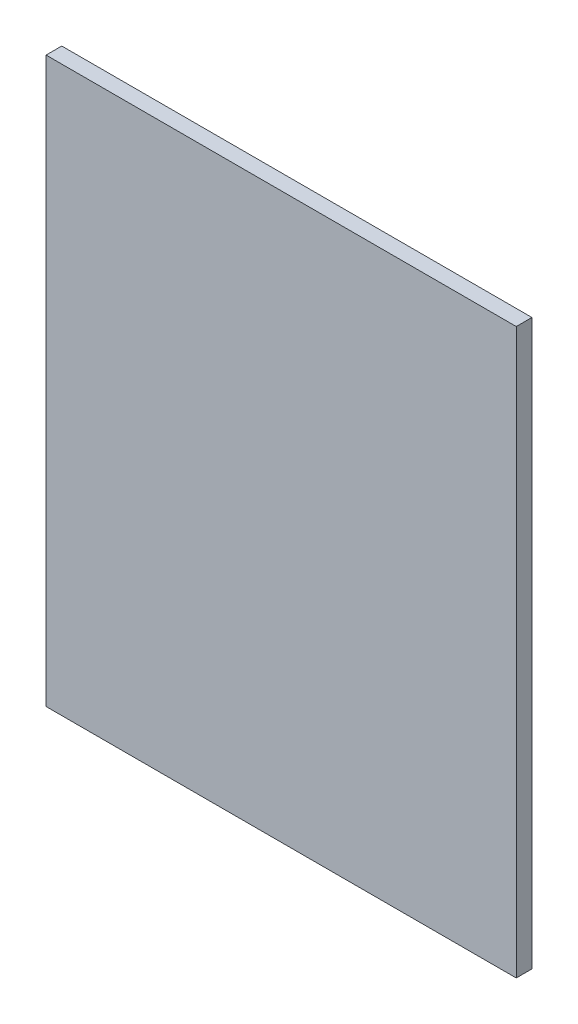
ISO-10303-21;
HEADER;
FILE_DESCRIPTION(('STEP AP214'),'2;1');
FILE_NAME('part.step','',(''),(''),'','','');
FILE_SCHEMA(('AUTOMOTIVE_DESIGN { 1 0 10303 214 1 1 1 1 }'));
ENDSEC;
DATA;
#1=APPLICATION_CONTEXT('core data for automotive mechanical design processes');
#2=APPLICATION_PROTOCOL_DEFINITION('international standard','automotive_design',2000,#1);
#3=PRODUCT_CONTEXT('',#1,'mechanical');
#4=PRODUCT('Part','Part','',(#3));
#5=PRODUCT_RELATED_PRODUCT_CATEGORY('part','',(#4));
#6=PRODUCT_DEFINITION_FORMATION('','',#4);
#7=PRODUCT_DEFINITION_CONTEXT('part definition',#1,'design');
#8=PRODUCT_DEFINITION('design','',#6,#7);
#9=PRODUCT_DEFINITION_SHAPE('','',#8);
#10=(LENGTH_UNIT() NAMED_UNIT(*) SI_UNIT(.MILLI.,.METRE.));
#11=(NAMED_UNIT(*) PLANE_ANGLE_UNIT() SI_UNIT($,.RADIAN.));
#12=(NAMED_UNIT(*) SI_UNIT($,.STERADIAN.) SOLID_ANGLE_UNIT());
#13=UNCERTAINTY_MEASURE_WITH_UNIT(LENGTH_MEASURE(1.E-05),#10,'distance_accuracy_value','');
#14=(GEOMETRIC_REPRESENTATION_CONTEXT(3) GLOBAL_UNCERTAINTY_ASSIGNED_CONTEXT((#13)) GLOBAL_UNIT_ASSIGNED_CONTEXT((#10,
#11,#12)) REPRESENTATION_CONTEXT('',''));
#15=CARTESIAN_POINT('',(0.,0.,0.));
#16=DIRECTION('',(0.,0.,1.));
#17=DIRECTION('',(1.,0.,0.));
#18=AXIS2_PLACEMENT_3D('',#15,#16,#17);
#19=CARTESIAN_POINT('',(0.,0.,6.35));
#20=DIRECTION('',(1.,0.,0.));
#21=DIRECTION('',(0.,1.,0.));
#22=AXIS2_PLACEMENT_3D('',#19,#20,#21);
#23=PLANE('',#22);
#24=DIRECTION('',(0.,-1.,0.));
#25=VECTOR('',#24,1.);
#26=CARTESIAN_POINT('',(0.,0.,0.));
#27=LINE('',#26,#25);
#28=CARTESIAN_POINT('',(0.,228.6,0.));
#29=VERTEX_POINT('',#28);
#30=CARTESIAN_POINT('',(0.,0.,0.));
#31=VERTEX_POINT('',#30);
#32=EDGE_CURVE('E99',#29,#31,#27,.T.);
#33=ORIENTED_EDGE('',*,*,#32,.T.);
#34=DIRECTION('',(0.,0.,-1.));
#35=VECTOR('',#34,1.);
#36=CARTESIAN_POINT('',(0.,0.,6.35));
#37=LINE('',#36,#35);
#38=CARTESIAN_POINT('',(0.,0.,6.35));
#39=VERTEX_POINT('',#38);
#40=EDGE_CURVE('E11',#39,#31,#37,.T.);
#41=ORIENTED_EDGE('',*,*,#40,.F.);
#42=DIRECTION('',(0.,-1.,0.));
#43=VECTOR('',#42,1.);
#44=CARTESIAN_POINT('',(0.,0.,6.35));
#45=LINE('',#44,#43);
#46=CARTESIAN_POINT('',(0.,228.6,6.35));
#47=VERTEX_POINT('',#46);
#48=EDGE_CURVE('E87',#47,#39,#45,.T.);
#49=ORIENTED_EDGE('',*,*,#48,.F.);
#50=DIRECTION('',(0.,0.,-1.));
#51=VECTOR('',#50,1.);
#52=CARTESIAN_POINT('',(0.,228.6,6.35));
#53=LINE('',#52,#51);
#54=EDGE_CURVE('E95',#47,#29,#53,.T.);
#55=ORIENTED_EDGE('',*,*,#54,.T.);
#56=EDGE_LOOP('',(#33,#41,#49,#55));
#57=FACE_BOUND('',#56,.T.);
#58=ADVANCED_FACE('F36',(#57),#23,.F.);
#59=CARTESIAN_POINT('',(0.,0.,6.35));
#60=DIRECTION('',(0.,1.,0.));
#61=DIRECTION('',(0.,0.,1.));
#62=AXIS2_PLACEMENT_3D('',#59,#60,#61);
#63=PLANE('',#62);
#64=DIRECTION('',(1.,0.,0.));
#65=VECTOR('',#64,1.);
#66=CARTESIAN_POINT('',(0.,0.,0.));
#67=LINE('',#66,#65);
#68=CARTESIAN_POINT('',(190.5,0.,0.));
#69=VERTEX_POINT('',#68);
#70=EDGE_CURVE('E91',#31,#69,#67,.T.);
#71=ORIENTED_EDGE('',*,*,#70,.T.);
#72=DIRECTION('',(0.,0.,-1.));
#73=VECTOR('',#72,1.);
#74=CARTESIAN_POINT('',(190.5,0.,6.35));
#75=LINE('',#74,#73);
#76=CARTESIAN_POINT('',(190.5,0.,6.35));
#77=VERTEX_POINT('',#76);
#78=EDGE_CURVE('E44',#77,#69,#75,.T.);
#79=ORIENTED_EDGE('',*,*,#78,.F.);
#80=DIRECTION('',(1.,0.,0.));
#81=VECTOR('',#80,1.);
#82=CARTESIAN_POINT('',(0.,0.,6.35));
#83=LINE('',#82,#81);
#84=EDGE_CURVE('E82',#39,#77,#83,.T.);
#85=ORIENTED_EDGE('',*,*,#84,.F.);
#86=ORIENTED_EDGE('',*,*,#40,.T.);
#87=EDGE_LOOP('',(#71,#79,#85,#86));
#88=FACE_BOUND('',#87,.T.);
#89=ADVANCED_FACE('F90',(#88),#63,.F.);
#90=CARTESIAN_POINT('',(190.5,0.,6.35));
#91=DIRECTION('',(-1.,0.,0.));
#92=DIRECTION('',(0.,-1.,0.));
#93=AXIS2_PLACEMENT_3D('',#90,#91,#92);
#94=PLANE('',#93);
#95=DIRECTION('',(0.,1.,0.));
#96=VECTOR('',#95,1.);
#97=CARTESIAN_POINT('',(190.5,0.,0.));
#98=LINE('',#97,#96);
#99=CARTESIAN_POINT('',(190.5,228.6,0.));
#100=VERTEX_POINT('',#99);
#101=EDGE_CURVE('E69',#69,#100,#98,.T.);
#102=ORIENTED_EDGE('',*,*,#101,.T.);
#103=DIRECTION('',(0.,0.,-1.));
#104=VECTOR('',#103,1.);
#105=CARTESIAN_POINT('',(190.5,228.6,6.35));
#106=LINE('',#105,#104);
#107=CARTESIAN_POINT('',(190.5,228.6,6.35));
#108=VERTEX_POINT('',#107);
#109=EDGE_CURVE('E92',#108,#100,#106,.T.);
#110=ORIENTED_EDGE('',*,*,#109,.F.);
#111=DIRECTION('',(0.,1.,0.));
#112=VECTOR('',#111,1.);
#113=CARTESIAN_POINT('',(190.5,0.,6.35));
#114=LINE('',#113,#112);
#115=EDGE_CURVE('E85',#77,#108,#114,.T.);
#116=ORIENTED_EDGE('',*,*,#115,.F.);
#117=ORIENTED_EDGE('',*,*,#78,.T.);
#118=EDGE_LOOP('',(#102,#110,#116,#117));
#119=FACE_BOUND('',#118,.T.);
#120=ADVANCED_FACE('F93',(#119),#94,.F.);
#121=CARTESIAN_POINT('',(0.,228.6,6.35));
#122=DIRECTION('',(0.,-1.,0.));
#123=DIRECTION('',(0.,0.,-1.));
#124=AXIS2_PLACEMENT_3D('',#121,#122,#123);
#125=PLANE('',#124);
#126=DIRECTION('',(-1.,0.,0.));
#127=VECTOR('',#126,1.);
#128=CARTESIAN_POINT('',(0.,228.6,0.));
#129=LINE('',#128,#127);
#130=EDGE_CURVE('E75',#100,#29,#129,.T.);
#131=ORIENTED_EDGE('',*,*,#130,.T.);
#132=ORIENTED_EDGE('',*,*,#54,.F.);
#133=DIRECTION('',(-1.,0.,0.));
#134=VECTOR('',#133,1.);
#135=CARTESIAN_POINT('',(0.,228.6,6.35));
#136=LINE('',#135,#134);
#137=EDGE_CURVE('E52',#108,#47,#136,.T.);
#138=ORIENTED_EDGE('',*,*,#137,.F.);
#139=ORIENTED_EDGE('',*,*,#109,.T.);
#140=EDGE_LOOP('',(#131,#132,#138,#139));
#141=FACE_BOUND('',#140,.T.);
#142=ADVANCED_FACE('F106',(#141),#125,.F.);
#143=CARTESIAN_POINT('',(0.,0.,6.35));
#144=DIRECTION('',(0.,0.,-1.));
#145=DIRECTION('',(-1.,0.,0.));
#146=AXIS2_PLACEMENT_3D('',#143,#144,#145);
#147=PLANE('',#146);
#148=ORIENTED_EDGE('',*,*,#48,.T.);
#149=ORIENTED_EDGE('',*,*,#84,.T.);
#150=ORIENTED_EDGE('',*,*,#115,.T.);
#151=ORIENTED_EDGE('',*,*,#137,.T.);
#152=EDGE_LOOP('',(#148,#149,#150,#151));
#153=FACE_BOUND('',#152,.T.);
#154=ADVANCED_FACE('F83',(#153),#147,.F.);
#155=CARTESIAN_POINT('',(0.,0.,0.));
#156=DIRECTION('',(0.,0.,-1.));
#157=DIRECTION('',(-1.,0.,0.));
#158=AXIS2_PLACEMENT_3D('',#155,#156,#157);
#159=PLANE('',#158);
#160=ORIENTED_EDGE('',*,*,#32,.F.);
#161=ORIENTED_EDGE('',*,*,#130,.F.);
#162=ORIENTED_EDGE('',*,*,#101,.F.);
#163=ORIENTED_EDGE('',*,*,#70,.F.);
#164=EDGE_LOOP('',(#160,#161,#162,#163));
#165=FACE_BOUND('',#164,.T.);
#166=ADVANCED_FACE('F109',(#165),#159,.T.);
#167=CLOSED_SHELL('',(#58,#89,#120,#142,#154,#166));
#168=MANIFOLD_SOLID_BREP('B2',#167);
#169=ADVANCED_BREP_SHAPE_REPRESENTATION('',(#18,#168),#14);
#170=SHAPE_DEFINITION_REPRESENTATION(#9,#169);
ENDSEC;
END-ISO-10303-21;
